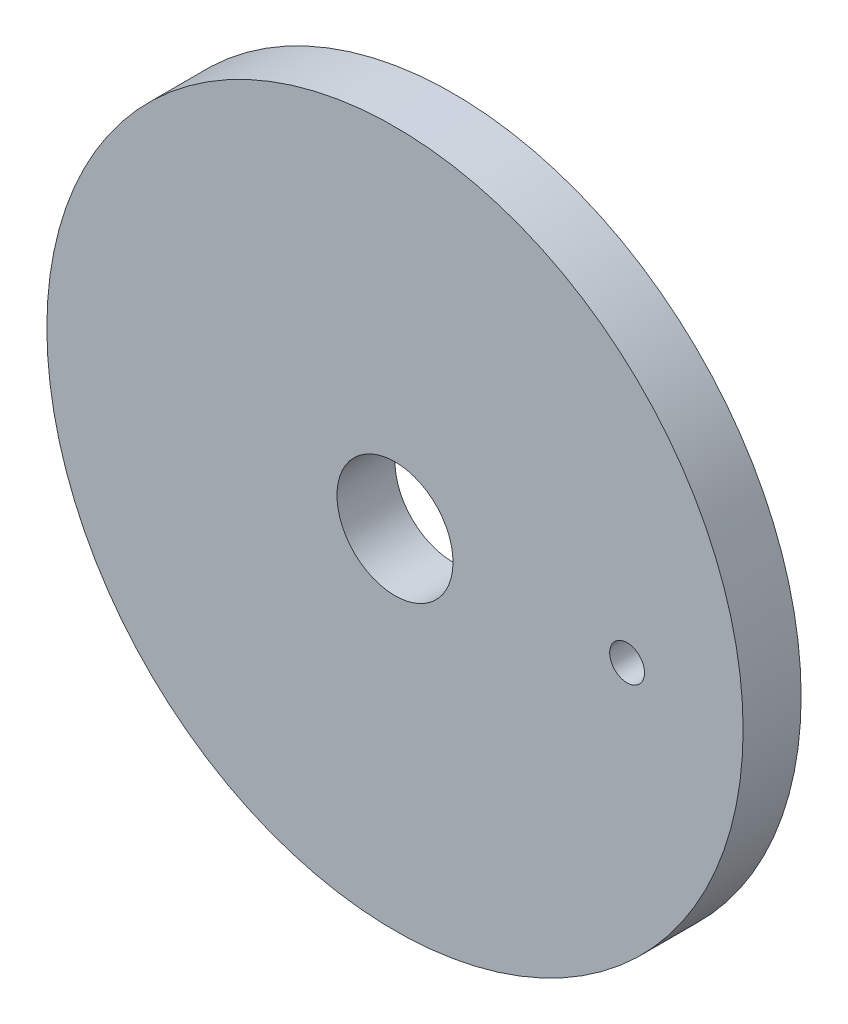
ISO-10303-21;
HEADER;
FILE_DESCRIPTION(('STEP AP214'),'2;1');
FILE_NAME('part.step','',(''),(''),'','','');
FILE_SCHEMA(('AUTOMOTIVE_DESIGN { 1 0 10303 214 1 1 1 1 }'));
ENDSEC;
DATA;
#1=APPLICATION_CONTEXT('core data for automotive mechanical design processes');
#2=APPLICATION_PROTOCOL_DEFINITION('international standard','automotive_design',2000,#1);
#3=PRODUCT_CONTEXT('',#1,'mechanical');
#4=PRODUCT('Part','Part','',(#3));
#5=PRODUCT_RELATED_PRODUCT_CATEGORY('part','',(#4));
#6=PRODUCT_DEFINITION_FORMATION('','',#4);
#7=PRODUCT_DEFINITION_CONTEXT('part definition',#1,'design');
#8=PRODUCT_DEFINITION('design','',#6,#7);
#9=PRODUCT_DEFINITION_SHAPE('','',#8);
#10=(LENGTH_UNIT() NAMED_UNIT(*) SI_UNIT(.MILLI.,.METRE.));
#11=(NAMED_UNIT(*) PLANE_ANGLE_UNIT() SI_UNIT($,.RADIAN.));
#12=(NAMED_UNIT(*) SI_UNIT($,.STERADIAN.) SOLID_ANGLE_UNIT());
#13=UNCERTAINTY_MEASURE_WITH_UNIT(LENGTH_MEASURE(1.E-05),#10,'distance_accuracy_value','');
#14=(GEOMETRIC_REPRESENTATION_CONTEXT(3) GLOBAL_UNCERTAINTY_ASSIGNED_CONTEXT((#13)) GLOBAL_UNIT_ASSIGNED_CONTEXT((#10,
#11,#12)) REPRESENTATION_CONTEXT('',''));
#15=CARTESIAN_POINT('',(0.,0.,0.));
#16=DIRECTION('',(0.,0.,1.));
#17=DIRECTION('',(1.,0.,0.));
#18=AXIS2_PLACEMENT_3D('',#15,#16,#17);
#19=CARTESIAN_POINT('',(0.,0.,12.7));
#20=DIRECTION('',(0.,0.,-1.));
#21=DIRECTION('',(-1.,0.,0.));
#22=AXIS2_PLACEMENT_3D('',#19,#20,#21);
#23=CYLINDRICAL_SURFACE('',#22,76.2);
#24=CARTESIAN_POINT('',(0.,0.,12.7));
#25=DIRECTION('',(0.,0.,1.));
#26=DIRECTION('',(1.,0.,0.));
#27=AXIS2_PLACEMENT_3D('',#24,#25,#26);
#28=CIRCLE('',#27,76.2);
#29=CARTESIAN_POINT('',(76.2,0.,12.7));
#30=VERTEX_POINT('',#29);
#31=EDGE_CURVE('E10',#30,#30,#28,.T.);
#32=ORIENTED_EDGE('',*,*,#31,.F.);
#33=EDGE_LOOP('',(#32));
#34=FACE_BOUND('',#33,.T.);
#35=CARTESIAN_POINT('',(0.,0.,0.));
#36=DIRECTION('',(0.,0.,1.));
#37=DIRECTION('',(1.,0.,0.));
#38=AXIS2_PLACEMENT_3D('',#35,#36,#37);
#39=CIRCLE('',#38,76.2);
#40=CARTESIAN_POINT('',(76.2,0.,0.));
#41=VERTEX_POINT('',#40);
#42=EDGE_CURVE('E37',#41,#41,#39,.T.);
#43=ORIENTED_EDGE('',*,*,#42,.T.);
#44=EDGE_LOOP('',(#43));
#45=FACE_BOUND('',#44,.T.);
#46=ADVANCED_FACE('F40',(#34,#45),#23,.T.);
#47=CARTESIAN_POINT('',(0.,0.,12.7));
#48=DIRECTION('',(0.,0.,1.));
#49=DIRECTION('',(1.,0.,0.));
#50=AXIS2_PLACEMENT_3D('',#47,#48,#49);
#51=PLANE('',#50);
#52=CARTESIAN_POINT('',(50.8,0.,12.7));
#53=DIRECTION('',(0.,0.,1.));
#54=DIRECTION('',(1.,0.,0.));
#55=AXIS2_PLACEMENT_3D('',#52,#53,#54);
#56=CIRCLE('',#55,3.81);
#57=CARTESIAN_POINT('',(54.61,0.,12.7));
#58=VERTEX_POINT('',#57);
#59=EDGE_CURVE('E55',#58,#58,#56,.T.);
#60=ORIENTED_EDGE('',*,*,#59,.F.);
#61=EDGE_LOOP('',(#60));
#62=FACE_BOUND('',#61,.T.);
#63=CARTESIAN_POINT('',(0.,0.,12.7));
#64=DIRECTION('',(0.,0.,1.));
#65=DIRECTION('',(1.,0.,0.));
#66=AXIS2_PLACEMENT_3D('',#63,#64,#65);
#67=CIRCLE('',#66,12.7);
#68=CARTESIAN_POINT('',(12.7,0.,12.7));
#69=VERTEX_POINT('',#68);
#70=EDGE_CURVE('E50',#69,#69,#67,.T.);
#71=ORIENTED_EDGE('',*,*,#70,.F.);
#72=EDGE_LOOP('',(#71));
#73=FACE_BOUND('',#72,.T.);
#74=ORIENTED_EDGE('',*,*,#31,.T.);
#75=EDGE_LOOP('',(#74));
#76=FACE_BOUND('',#75,.T.);
#77=ADVANCED_FACE('F61',(#62,#73,#76),#51,.T.);
#78=CARTESIAN_POINT('',(0.,0.,0.));
#79=DIRECTION('',(0.,0.,1.));
#80=DIRECTION('',(1.,0.,0.));
#81=AXIS2_PLACEMENT_3D('',#78,#79,#80);
#82=PLANE('',#81);
#83=CARTESIAN_POINT('',(50.8,0.,0.));
#84=DIRECTION('',(0.,0.,1.));
#85=DIRECTION('',(1.,0.,0.));
#86=AXIS2_PLACEMENT_3D('',#83,#84,#85);
#87=CIRCLE('',#86,3.81);
#88=CARTESIAN_POINT('',(54.61,0.,0.));
#89=VERTEX_POINT('',#88);
#90=EDGE_CURVE('E54',#89,#89,#87,.T.);
#91=ORIENTED_EDGE('',*,*,#90,.T.);
#92=EDGE_LOOP('',(#91));
#93=FACE_BOUND('',#92,.T.);
#94=CARTESIAN_POINT('',(0.,0.,0.));
#95=DIRECTION('',(0.,0.,1.));
#96=DIRECTION('',(1.,0.,0.));
#97=AXIS2_PLACEMENT_3D('',#94,#95,#96);
#98=CIRCLE('',#97,12.7);
#99=CARTESIAN_POINT('',(12.7,0.,0.));
#100=VERTEX_POINT('',#99);
#101=EDGE_CURVE('E47',#100,#100,#98,.T.);
#102=ORIENTED_EDGE('',*,*,#101,.T.);
#103=EDGE_LOOP('',(#102));
#104=FACE_BOUND('',#103,.T.);
#105=ORIENTED_EDGE('',*,*,#42,.F.);
#106=EDGE_LOOP('',(#105));
#107=FACE_BOUND('',#106,.T.);
#108=ADVANCED_FACE('F70',(#93,#104,#107),#82,.F.);
#109=CARTESIAN_POINT('',(0.,0.,12.7));
#110=DIRECTION('',(0.,0.,-1.));
#111=DIRECTION('',(-1.,0.,0.));
#112=AXIS2_PLACEMENT_3D('',#109,#110,#111);
#113=CYLINDRICAL_SURFACE('',#112,12.7);
#114=ORIENTED_EDGE('',*,*,#70,.T.);
#115=EDGE_LOOP('',(#114));
#116=FACE_BOUND('',#115,.T.);
#117=ORIENTED_EDGE('',*,*,#101,.F.);
#118=EDGE_LOOP('',(#117));
#119=FACE_BOUND('',#118,.T.);
#120=ADVANCED_FACE('F72',(#116,#119),#113,.F.);
#121=CARTESIAN_POINT('',(50.8,0.,12.7));
#122=DIRECTION('',(0.,0.,-1.));
#123=DIRECTION('',(-1.,0.,0.));
#124=AXIS2_PLACEMENT_3D('',#121,#122,#123);
#125=CYLINDRICAL_SURFACE('',#124,3.81);
#126=ORIENTED_EDGE('',*,*,#59,.T.);
#127=EDGE_LOOP('',(#126));
#128=FACE_BOUND('',#127,.T.);
#129=ORIENTED_EDGE('',*,*,#90,.F.);
#130=EDGE_LOOP('',(#129));
#131=FACE_BOUND('',#130,.T.);
#132=ADVANCED_FACE('F62',(#128,#131),#125,.F.);
#133=CLOSED_SHELL('',(#46,#77,#108,#120,#132));
#134=MANIFOLD_SOLID_BREP('B2',#133);
#135=ADVANCED_BREP_SHAPE_REPRESENTATION('',(#18,#134),#14);
#136=SHAPE_DEFINITION_REPRESENTATION(#9,#135);
ENDSEC;
END-ISO-10303-21;
